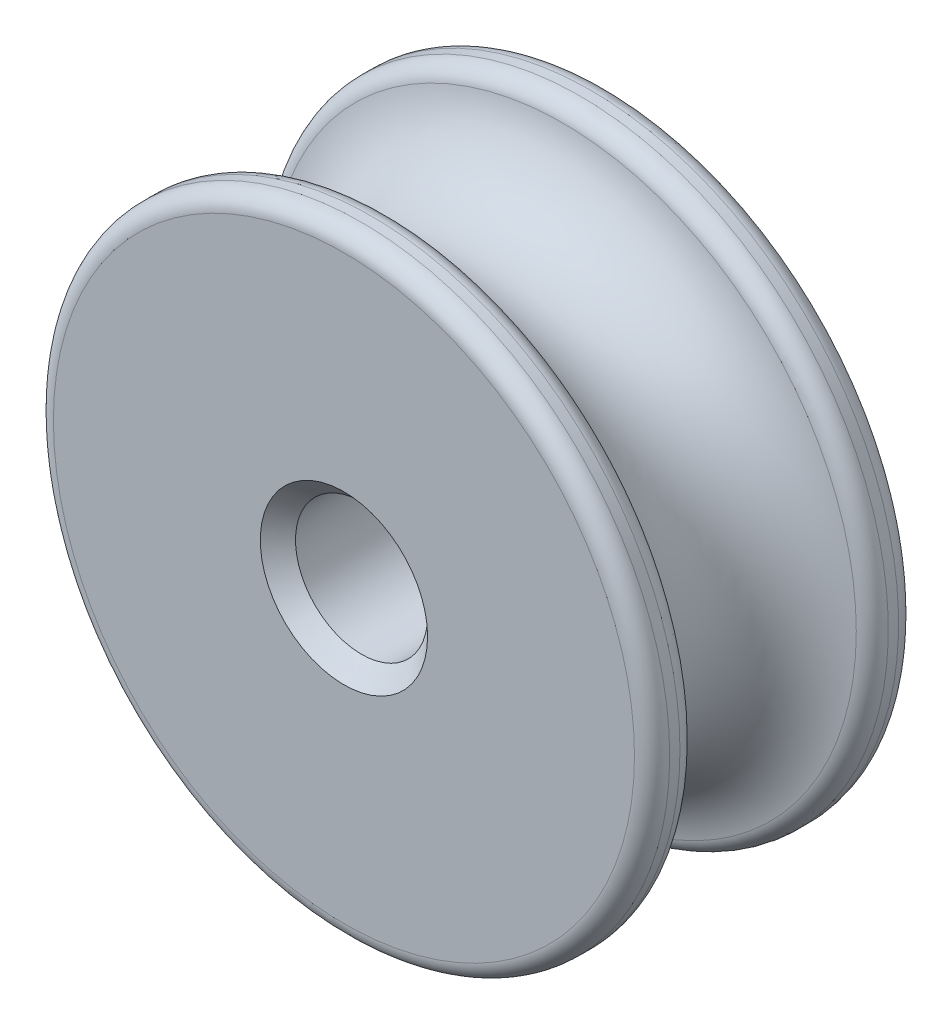
ISO-10303-21;
HEADER;
FILE_DESCRIPTION(('STEP AP214'),'2;1');
FILE_NAME('part.step','',(''),(''),'','','');
FILE_SCHEMA(('AUTOMOTIVE_DESIGN { 1 0 10303 214 1 1 1 1 }'));
ENDSEC;
DATA;
#1=APPLICATION_CONTEXT('core data for automotive mechanical design processes');
#2=APPLICATION_PROTOCOL_DEFINITION('international standard','automotive_design',2000,#1);
#3=PRODUCT_CONTEXT('',#1,'mechanical');
#4=PRODUCT('Part','Part','',(#3));
#5=PRODUCT_RELATED_PRODUCT_CATEGORY('part','',(#4));
#6=PRODUCT_DEFINITION_FORMATION('','',#4);
#7=PRODUCT_DEFINITION_CONTEXT('part definition',#1,'design');
#8=PRODUCT_DEFINITION('design','',#6,#7);
#9=PRODUCT_DEFINITION_SHAPE('','',#8);
#10=(LENGTH_UNIT() NAMED_UNIT(*) SI_UNIT(.MILLI.,.METRE.));
#11=(NAMED_UNIT(*) PLANE_ANGLE_UNIT() SI_UNIT($,.RADIAN.));
#12=(NAMED_UNIT(*) SI_UNIT($,.STERADIAN.) SOLID_ANGLE_UNIT());
#13=UNCERTAINTY_MEASURE_WITH_UNIT(LENGTH_MEASURE(1.E-05),#10,'distance_accuracy_value','');
#14=(GEOMETRIC_REPRESENTATION_CONTEXT(3) GLOBAL_UNCERTAINTY_ASSIGNED_CONTEXT((#13)) GLOBAL_UNIT_ASSIGNED_CONTEXT((#10,
#11,#12)) REPRESENTATION_CONTEXT('',''));
#15=CARTESIAN_POINT('',(0.,0.,0.));
#16=DIRECTION('',(0.,0.,1.));
#17=DIRECTION('',(1.,0.,0.));
#18=AXIS2_PLACEMENT_3D('',#15,#16,#17);
#19=CARTESIAN_POINT('',(0.,0.,-7.62));
#20=DIRECTION('',(0.,0.,-1.));
#21=DIRECTION('',(-1.,0.,0.));
#22=AXIS2_PLACEMENT_3D('',#19,#20,#21);
#23=PLANE('',#22);
#24=CARTESIAN_POINT('',(0.,0.,-7.62));
#25=DIRECTION('',(0.,0.,-1.));
#26=DIRECTION('',(-1.,0.,0.));
#27=AXIS2_PLACEMENT_3D('',#24,#25,#26);
#28=CIRCLE('',#27,2.413);
#29=CARTESIAN_POINT('',(-2.413,0.,-7.62));
#30=VERTEX_POINT('',#29);
#31=EDGE_CURVE('E10',#30,#30,#28,.F.);
#32=ORIENTED_EDGE('',*,*,#31,.T.);
#33=EDGE_LOOP('',(#32));
#34=FACE_BOUND('',#33,.T.);
#35=CARTESIAN_POINT('',(0.,0.,-7.62));
#36=DIRECTION('',(0.,0.,-1.));
#37=DIRECTION('',(-1.,0.,0.));
#38=AXIS2_PLACEMENT_3D('',#35,#36,#37);
#39=CIRCLE('',#38,8.382);
#40=CARTESIAN_POINT('',(-8.382,0.,-7.62));
#41=VERTEX_POINT('',#40);
#42=EDGE_CURVE('E66',#41,#41,#39,.T.);
#43=ORIENTED_EDGE('',*,*,#42,.T.);
#44=EDGE_LOOP('',(#43));
#45=FACE_BOUND('',#44,.T.);
#46=ADVANCED_FACE('F31',(#34,#45),#23,.T.);
#47=CARTESIAN_POINT('',(0.,0.,0.));
#48=DIRECTION('',(0.,0.,1.));
#49=DIRECTION('',(1.,0.,0.));
#50=AXIS2_PLACEMENT_3D('',#47,#48,#49);
#51=CYLINDRICAL_SURFACE('',#50,8.89);
#52=CARTESIAN_POINT('',(0.,0.,-7.112));
#53=DIRECTION('',(0.,0.,-1.));
#54=DIRECTION('',(-1.,0.,0.));
#55=AXIS2_PLACEMENT_3D('',#52,#53,#54);
#56=CIRCLE('',#55,8.89);
#57=CARTESIAN_POINT('',(-8.89,0.,-7.112));
#58=VERTEX_POINT('',#57);
#59=EDGE_CURVE('E69',#58,#58,#56,.F.);
#60=ORIENTED_EDGE('',*,*,#59,.T.);
#61=EDGE_LOOP('',(#60));
#62=FACE_BOUND('',#61,.T.);
#63=CARTESIAN_POINT('',(0.,0.,-6.8153685298146));
#64=DIRECTION('',(0.,0.,-1.));
#65=DIRECTION('',(-1.,0.,0.));
#66=AXIS2_PLACEMENT_3D('',#63,#64,#65);
#67=CIRCLE('',#66,8.89);
#68=CARTESIAN_POINT('',(-8.89,0.,-6.8153685298146));
#69=VERTEX_POINT('',#68);
#70=EDGE_CURVE('E72',#69,#69,#67,.T.);
#71=ORIENTED_EDGE('',*,*,#70,.T.);
#72=EDGE_LOOP('',(#71));
#73=FACE_BOUND('',#72,.T.);
#74=ADVANCED_FACE('F76',(#62,#73),#51,.T.);
#75=CARTESIAN_POINT('',(0.,0.,-3.81));
#76=DIRECTION('',(0.,0.,1.));
#77=DIRECTION('',(1.,0.,0.));
#78=AXIS2_PLACEMENT_3D('',#75,#76,#77);
#79=TOROIDAL_SURFACE('',#78,8.89,2.54);
#80=CARTESIAN_POINT('',(0.,0.,-6.31447377484573));
#81=DIRECTION('',(0.,0.,1.));
#82=DIRECTION('',(1.,0.,0.));
#83=AXIS2_PLACEMENT_3D('',#80,#81,#82);
#84=CIRCLE('',#83,8.46666666666663);
#85=CARTESIAN_POINT('',(8.46666666666663,0.,-6.31447377484573));
#86=VERTEX_POINT('',#85);
#87=EDGE_CURVE('E60',#86,#86,#84,.T.);
#88=ORIENTED_EDGE('',*,*,#87,.T.);
#89=EDGE_LOOP('',(#88));
#90=FACE_BOUND('',#89,.T.);
#91=CARTESIAN_POINT('',(0.,0.,-1.30552622515433));
#92=DIRECTION('',(0.,0.,-1.));
#93=DIRECTION('',(-1.,0.,0.));
#94=AXIS2_PLACEMENT_3D('',#91,#92,#93);
#95=CIRCLE('',#94,8.46666666666664);
#96=CARTESIAN_POINT('',(-8.46666666666664,0.,-1.30552622515433));
#97=VERTEX_POINT('',#96);
#98=EDGE_CURVE('E63',#97,#97,#95,.T.);
#99=ORIENTED_EDGE('',*,*,#98,.T.);
#100=EDGE_LOOP('',(#99));
#101=FACE_BOUND('',#100,.T.);
#102=ADVANCED_FACE('F86',(#90,#101),#79,.F.);
#103=CARTESIAN_POINT('',(0.,0.,0.));
#104=DIRECTION('',(0.,0.,1.));
#105=DIRECTION('',(1.,0.,0.));
#106=AXIS2_PLACEMENT_3D('',#103,#104,#105);
#107=CYLINDRICAL_SURFACE('',#106,8.89);
#108=CARTESIAN_POINT('',(0.,0.,-0.507999999999999));
#109=DIRECTION('',(0.,0.,1.));
#110=DIRECTION('',(1.,0.,0.));
#111=AXIS2_PLACEMENT_3D('',#108,#109,#110);
#112=CIRCLE('',#111,8.89);
#113=CARTESIAN_POINT('',(8.89,0.,-0.508000000000001));
#114=VERTEX_POINT('',#113);
#115=EDGE_CURVE('E51',#114,#114,#112,.F.);
#116=ORIENTED_EDGE('',*,*,#115,.T.);
#117=EDGE_LOOP('',(#116));
#118=FACE_BOUND('',#117,.T.);
#119=CARTESIAN_POINT('',(0.,0.,-0.804631470185392));
#120=DIRECTION('',(0.,0.,-1.));
#121=DIRECTION('',(-1.,0.,0.));
#122=AXIS2_PLACEMENT_3D('',#119,#120,#121);
#123=CIRCLE('',#122,8.89);
#124=CARTESIAN_POINT('',(-8.89,0.,-0.80463147018539));
#125=VERTEX_POINT('',#124);
#126=EDGE_CURVE('E54',#125,#125,#123,.F.);
#127=ORIENTED_EDGE('',*,*,#126,.T.);
#128=EDGE_LOOP('',(#127));
#129=FACE_BOUND('',#128,.T.);
#130=ADVANCED_FACE('F89',(#118,#129),#107,.T.);
#131=CARTESIAN_POINT('',(0.,0.,0.));
#132=DIRECTION('',(0.,0.,1.));
#133=DIRECTION('',(1.,0.,0.));
#134=AXIS2_PLACEMENT_3D('',#131,#132,#133);
#135=PLANE('',#134);
#136=CARTESIAN_POINT('',(0.,0.,0.));
#137=DIRECTION('',(0.,0.,1.));
#138=DIRECTION('',(1.,0.,0.));
#139=AXIS2_PLACEMENT_3D('',#136,#137,#138);
#140=CIRCLE('',#139,2.41300000000001);
#141=CARTESIAN_POINT('',(2.41300000000001,0.,0.));
#142=VERTEX_POINT('',#141);
#143=EDGE_CURVE('E38',#142,#142,#140,.F.);
#144=ORIENTED_EDGE('',*,*,#143,.T.);
#145=EDGE_LOOP('',(#144));
#146=FACE_BOUND('',#145,.T.);
#147=CARTESIAN_POINT('',(0.,0.,0.));
#148=DIRECTION('',(0.,0.,1.));
#149=DIRECTION('',(1.,0.,0.));
#150=AXIS2_PLACEMENT_3D('',#147,#148,#149);
#151=CIRCLE('',#150,8.382);
#152=CARTESIAN_POINT('',(8.382,0.,0.));
#153=VERTEX_POINT('',#152);
#154=EDGE_CURVE('E57',#153,#153,#151,.T.);
#155=ORIENTED_EDGE('',*,*,#154,.T.);
#156=EDGE_LOOP('',(#155));
#157=FACE_BOUND('',#156,.T.);
#158=ADVANCED_FACE('F101',(#146,#157),#135,.T.);
#159=CARTESIAN_POINT('',(0.,0.,-7.112));
#160=DIRECTION('',(0.,0.,-1.));
#161=DIRECTION('',(-1.,0.,0.));
#162=AXIS2_PLACEMENT_3D('',#159,#160,#161);
#163=TOROIDAL_SURFACE('',#162,8.382,0.508);
#164=ORIENTED_EDGE('',*,*,#42,.F.);
#165=EDGE_LOOP('',(#164));
#166=FACE_BOUND('',#165,.T.);
#167=ORIENTED_EDGE('',*,*,#59,.F.);
#168=EDGE_LOOP('',(#167));
#169=FACE_BOUND('',#168,.T.);
#170=ADVANCED_FACE('F82',(#166,#169),#163,.T.);
#171=CARTESIAN_POINT('',(0.,0.,-6.8153685298146));
#172=DIRECTION('',(0.,0.,-1.));
#173=DIRECTION('',(-1.,0.,0.));
#174=AXIS2_PLACEMENT_3D('',#171,#172,#173);
#175=TOROIDAL_SURFACE('',#174,8.382,0.508);
#176=ORIENTED_EDGE('',*,*,#70,.F.);
#177=EDGE_LOOP('',(#176));
#178=FACE_BOUND('',#177,.T.);
#179=ORIENTED_EDGE('',*,*,#87,.F.);
#180=EDGE_LOOP('',(#179));
#181=FACE_BOUND('',#180,.T.);
#182=ADVANCED_FACE('F78',(#178,#181),#175,.T.);
#183=CARTESIAN_POINT('',(0.,0.,-0.507999999999999));
#184=DIRECTION('',(0.,0.,1.));
#185=DIRECTION('',(1.,0.,0.));
#186=AXIS2_PLACEMENT_3D('',#183,#184,#185);
#187=TOROIDAL_SURFACE('',#186,8.382,0.508);
#188=ORIENTED_EDGE('',*,*,#115,.F.);
#189=EDGE_LOOP('',(#188));
#190=FACE_BOUND('',#189,.T.);
#191=ORIENTED_EDGE('',*,*,#154,.F.);
#192=EDGE_LOOP('',(#191));
#193=FACE_BOUND('',#192,.T.);
#194=ADVANCED_FACE('F81',(#190,#193),#187,.T.);
#195=CARTESIAN_POINT('',(0.,0.,-0.804631470185392));
#196=DIRECTION('',(0.,0.,-1.));
#197=DIRECTION('',(-1.,0.,0.));
#198=AXIS2_PLACEMENT_3D('',#195,#196,#197);
#199=TOROIDAL_SURFACE('',#198,8.382,0.508);
#200=ORIENTED_EDGE('',*,*,#98,.F.);
#201=EDGE_LOOP('',(#200));
#202=FACE_BOUND('',#201,.T.);
#203=ORIENTED_EDGE('',*,*,#126,.F.);
#204=EDGE_LOOP('',(#203));
#205=FACE_BOUND('',#204,.T.);
#206=ADVANCED_FACE('F93',(#202,#205),#199,.T.);
#207=CARTESIAN_POINT('',(0.,0.,-7.62));
#208=DIRECTION('',(0.,0.,1.));
#209=DIRECTION('',(1.,0.,0.));
#210=AXIS2_PLACEMENT_3D('',#207,#208,#209);
#211=CYLINDRICAL_SURFACE('',#210,1.905);
#212=CARTESIAN_POINT('',(0.,0.,-0.508000000000002));
#213=DIRECTION('',(0.,0.,1.));
#214=DIRECTION('',(1.,0.,0.));
#215=AXIS2_PLACEMENT_3D('',#212,#213,#214);
#216=CIRCLE('',#215,1.905);
#217=CARTESIAN_POINT('',(1.905,0.,-0.508000000000002));
#218=VERTEX_POINT('',#217);
#219=EDGE_CURVE('E42',#218,#218,#216,.T.);
#220=ORIENTED_EDGE('',*,*,#219,.T.);
#221=EDGE_LOOP('',(#220));
#222=FACE_BOUND('',#221,.T.);
#223=CARTESIAN_POINT('',(0.,0.,-7.112));
#224=DIRECTION('',(0.,0.,-1.));
#225=DIRECTION('',(-1.,0.,0.));
#226=AXIS2_PLACEMENT_3D('',#223,#224,#225);
#227=CIRCLE('',#226,1.905);
#228=CARTESIAN_POINT('',(-1.905,0.,-7.112));
#229=VERTEX_POINT('',#228);
#230=EDGE_CURVE('E46',#229,#229,#227,.T.);
#231=ORIENTED_EDGE('',*,*,#230,.T.);
#232=EDGE_LOOP('',(#231));
#233=FACE_BOUND('',#232,.T.);
#234=ADVANCED_FACE('F96',(#222,#233),#211,.F.);
#235=CARTESIAN_POINT('',(0.,0.,-0.508000000000002));
#236=DIRECTION('',(0.,0.,1.));
#237=DIRECTION('',(1.,0.,0.));
#238=AXIS2_PLACEMENT_3D('',#235,#236,#237);
#239=CONICAL_SURFACE('',#238,1.905,0.785398163397454);
#240=ORIENTED_EDGE('',*,*,#143,.F.);
#241=EDGE_LOOP('',(#240));
#242=FACE_BOUND('',#241,.T.);
#243=ORIENTED_EDGE('',*,*,#219,.F.);
#244=EDGE_LOOP('',(#243));
#245=FACE_BOUND('',#244,.T.);
#246=ADVANCED_FACE('F124',(#242,#245),#239,.F.);
#247=CARTESIAN_POINT('',(0.,0.,-7.62));
#248=DIRECTION('',(0.,0.,-1.));
#249=DIRECTION('',(-1.,0.,0.));
#250=AXIS2_PLACEMENT_3D('',#247,#248,#249);
#251=CONICAL_SURFACE('',#250,2.413,0.785398163397447);
#252=ORIENTED_EDGE('',*,*,#230,.F.);
#253=EDGE_LOOP('',(#252));
#254=FACE_BOUND('',#253,.T.);
#255=ORIENTED_EDGE('',*,*,#31,.F.);
#256=EDGE_LOOP('',(#255));
#257=FACE_BOUND('',#256,.T.);
#258=ADVANCED_FACE('F33',(#254,#257),#251,.F.);
#259=CLOSED_SHELL('',(#46,#74,#102,#130,#158,#170,#182,#194,#206,#234,#246,#258));
#260=MANIFOLD_SOLID_BREP('B2',#259);
#261=ADVANCED_BREP_SHAPE_REPRESENTATION('',(#18,#260),#14);
#262=SHAPE_DEFINITION_REPRESENTATION(#9,#261);
ENDSEC;
END-ISO-10303-21;
